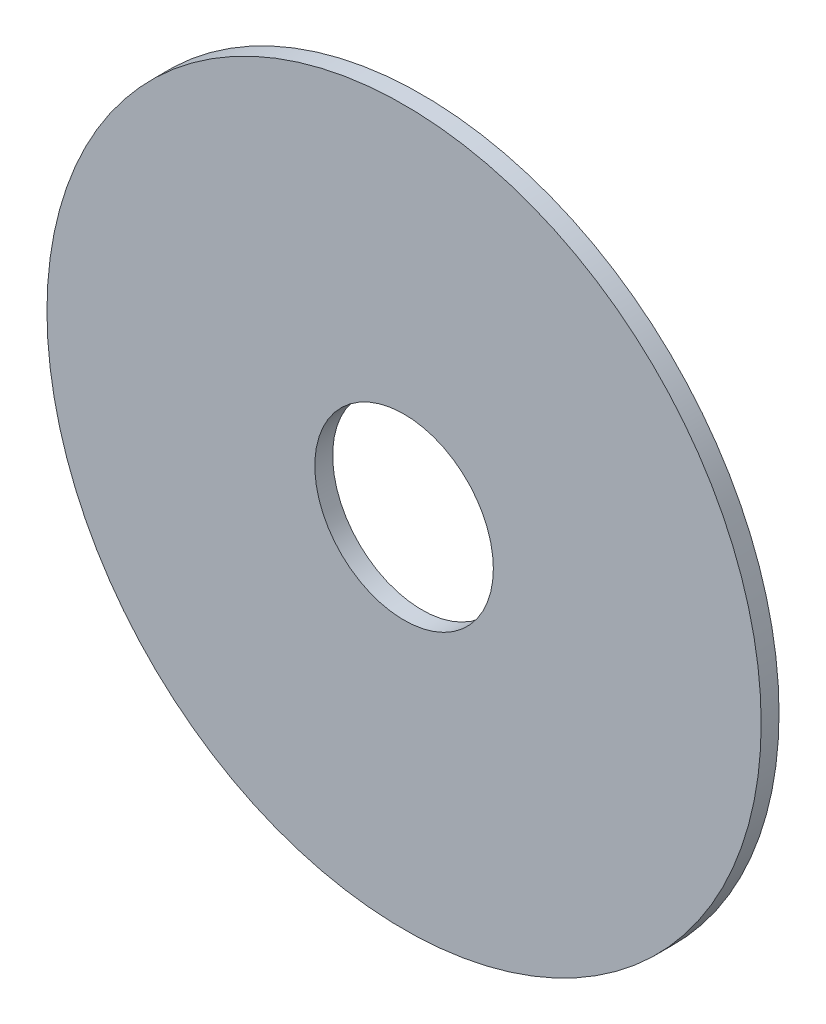
ISO-10303-21;
HEADER;
FILE_DESCRIPTION(('STEP AP214'),'2;1');
FILE_NAME('part.step','',(''),(''),'','','');
FILE_SCHEMA(('AUTOMOTIVE_DESIGN { 1 0 10303 214 1 1 1 1 }'));
ENDSEC;
DATA;
#1=APPLICATION_CONTEXT('core data for automotive mechanical design processes');
#2=APPLICATION_PROTOCOL_DEFINITION('international standard','automotive_design',2000,#1);
#3=PRODUCT_CONTEXT('',#1,'mechanical');
#4=PRODUCT('Part','Part','',(#3));
#5=PRODUCT_RELATED_PRODUCT_CATEGORY('part','',(#4));
#6=PRODUCT_DEFINITION_FORMATION('','',#4);
#7=PRODUCT_DEFINITION_CONTEXT('part definition',#1,'design');
#8=PRODUCT_DEFINITION('design','',#6,#7);
#9=PRODUCT_DEFINITION_SHAPE('','',#8);
#10=(LENGTH_UNIT() NAMED_UNIT(*) SI_UNIT(.MILLI.,.METRE.));
#11=(NAMED_UNIT(*) PLANE_ANGLE_UNIT() SI_UNIT($,.RADIAN.));
#12=(NAMED_UNIT(*) SI_UNIT($,.STERADIAN.) SOLID_ANGLE_UNIT());
#13=UNCERTAINTY_MEASURE_WITH_UNIT(LENGTH_MEASURE(1.E-05),#10,'distance_accuracy_value','');
#14=(GEOMETRIC_REPRESENTATION_CONTEXT(3) GLOBAL_UNCERTAINTY_ASSIGNED_CONTEXT((#13)) GLOBAL_UNIT_ASSIGNED_CONTEXT((#10,
#11,#12)) REPRESENTATION_CONTEXT('',''));
#15=CARTESIAN_POINT('',(0.,0.,0.));
#16=DIRECTION('',(0.,0.,1.));
#17=DIRECTION('',(1.,0.,0.));
#18=AXIS2_PLACEMENT_3D('',#15,#16,#17);
#19=CARTESIAN_POINT('',(0.,0.,2.5));
#20=DIRECTION('',(0.,0.,1.));
#21=DIRECTION('',(1.,0.,0.));
#22=AXIS2_PLACEMENT_3D('',#19,#20,#21);
#23=PLANE('',#22);
#24=CARTESIAN_POINT('',(0.,0.,2.5));
#25=DIRECTION('',(0.,0.,1.));
#26=DIRECTION('',(1.,0.,0.));
#27=AXIS2_PLACEMENT_3D('',#24,#25,#26);
#28=CIRCLE('',#27,50.);
#29=CARTESIAN_POINT('',(50.,0.,2.5));
#30=VERTEX_POINT('',#29);
#31=EDGE_CURVE('E10',#30,#30,#28,.T.);
#32=ORIENTED_EDGE('',*,*,#31,.T.);
#33=EDGE_LOOP('',(#32));
#34=FACE_BOUND('',#33,.T.);
#35=CARTESIAN_POINT('',(0.,0.,2.5));
#36=DIRECTION('',(0.,0.,1.));
#37=DIRECTION('',(1.,0.,0.));
#38=AXIS2_PLACEMENT_3D('',#35,#36,#37);
#39=CIRCLE('',#38,12.5);
#40=CARTESIAN_POINT('',(12.5,0.,2.5));
#41=VERTEX_POINT('',#40);
#42=EDGE_CURVE('E42',#41,#41,#39,.T.);
#43=ORIENTED_EDGE('',*,*,#42,.F.);
#44=EDGE_LOOP('',(#43));
#45=FACE_BOUND('',#44,.T.);
#46=ADVANCED_FACE('F31',(#34,#45),#23,.T.);
#47=CARTESIAN_POINT('',(0.,0.,0.));
#48=DIRECTION('',(0.,0.,1.));
#49=DIRECTION('',(1.,0.,0.));
#50=AXIS2_PLACEMENT_3D('',#47,#48,#49);
#51=PLANE('',#50);
#52=CARTESIAN_POINT('',(0.,0.,0.));
#53=DIRECTION('',(0.,0.,1.));
#54=DIRECTION('',(1.,0.,0.));
#55=AXIS2_PLACEMENT_3D('',#52,#53,#54);
#56=CIRCLE('',#55,50.);
#57=CARTESIAN_POINT('',(50.,0.,0.));
#58=VERTEX_POINT('',#57);
#59=EDGE_CURVE('E35',#58,#58,#56,.T.);
#60=ORIENTED_EDGE('',*,*,#59,.F.);
#61=EDGE_LOOP('',(#60));
#62=FACE_BOUND('',#61,.T.);
#63=CARTESIAN_POINT('',(0.,0.,0.));
#64=DIRECTION('',(0.,0.,1.));
#65=DIRECTION('',(1.,0.,0.));
#66=AXIS2_PLACEMENT_3D('',#63,#64,#65);
#67=CIRCLE('',#66,12.5);
#68=CARTESIAN_POINT('',(12.5,0.,0.));
#69=VERTEX_POINT('',#68);
#70=EDGE_CURVE('E44',#69,#69,#67,.T.);
#71=ORIENTED_EDGE('',*,*,#70,.T.);
#72=EDGE_LOOP('',(#71));
#73=FACE_BOUND('',#72,.T.);
#74=ADVANCED_FACE('F54',(#62,#73),#51,.F.);
#75=CARTESIAN_POINT('',(0.,0.,2.5));
#76=DIRECTION('',(0.,0.,-1.));
#77=DIRECTION('',(-1.,0.,0.));
#78=AXIS2_PLACEMENT_3D('',#75,#76,#77);
#79=CYLINDRICAL_SURFACE('',#78,50.);
#80=ORIENTED_EDGE('',*,*,#31,.F.);
#81=EDGE_LOOP('',(#80));
#82=FACE_BOUND('',#81,.T.);
#83=ORIENTED_EDGE('',*,*,#59,.T.);
#84=EDGE_LOOP('',(#83));
#85=FACE_BOUND('',#84,.T.);
#86=ADVANCED_FACE('F33',(#82,#85),#79,.T.);
#87=CARTESIAN_POINT('',(0.,0.,2.5));
#88=DIRECTION('',(0.,0.,-1.));
#89=DIRECTION('',(-1.,0.,0.));
#90=AXIS2_PLACEMENT_3D('',#87,#88,#89);
#91=CYLINDRICAL_SURFACE('',#90,12.5);
#92=ORIENTED_EDGE('',*,*,#42,.T.);
#93=EDGE_LOOP('',(#92));
#94=FACE_BOUND('',#93,.T.);
#95=ORIENTED_EDGE('',*,*,#70,.F.);
#96=EDGE_LOOP('',(#95));
#97=FACE_BOUND('',#96,.T.);
#98=ADVANCED_FACE('F50',(#94,#97),#91,.F.);
#99=CLOSED_SHELL('',(#46,#74,#86,#98));
#100=MANIFOLD_SOLID_BREP('B2',#99);
#101=ADVANCED_BREP_SHAPE_REPRESENTATION('',(#18,#100),#14);
#102=SHAPE_DEFINITION_REPRESENTATION(#9,#101);
ENDSEC;
END-ISO-10303-21;
